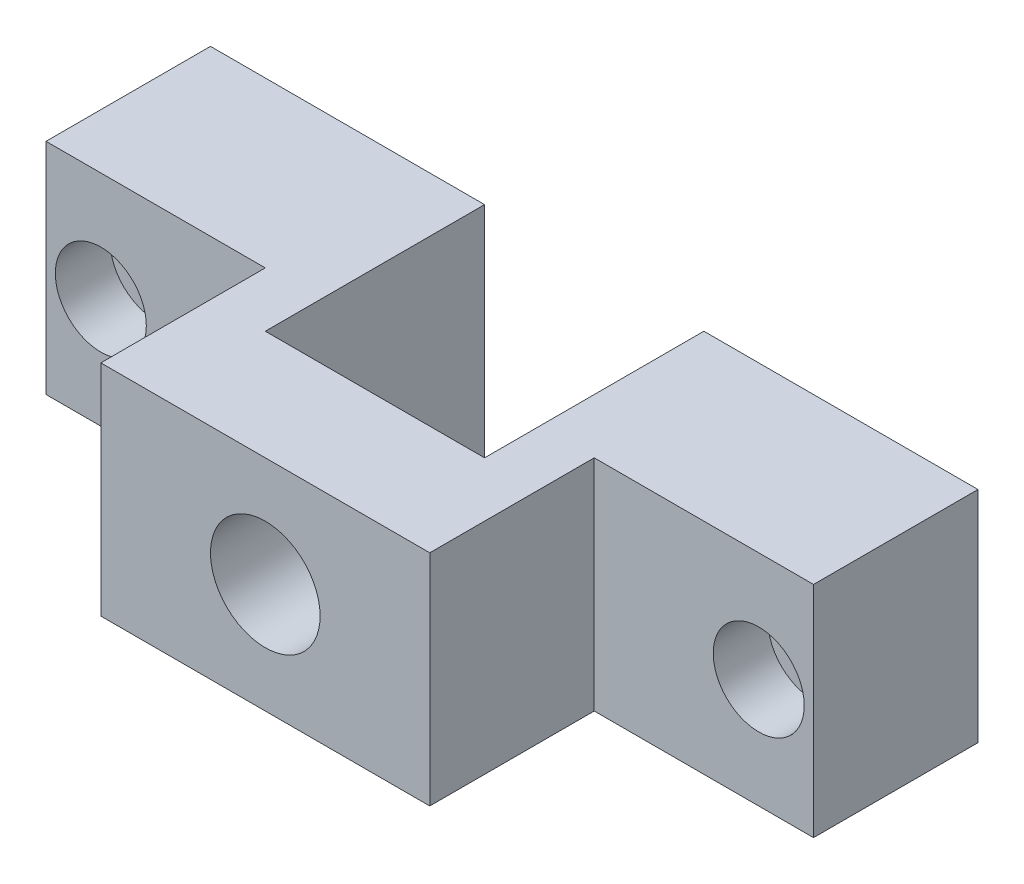
ISO-10303-21;
HEADER;
FILE_DESCRIPTION(('STEP AP214'),'2;1');
FILE_NAME('part.step','',(''),(''),'','','');
FILE_SCHEMA(('AUTOMOTIVE_DESIGN { 1 0 10303 214 1 1 1 1 }'));
ENDSEC;
DATA;
#1=APPLICATION_CONTEXT('core data for automotive mechanical design processes');
#2=APPLICATION_PROTOCOL_DEFINITION('international standard','automotive_design',2000,#1);
#3=PRODUCT_CONTEXT('',#1,'mechanical');
#4=PRODUCT('Part','Part','',(#3));
#5=PRODUCT_RELATED_PRODUCT_CATEGORY('part','',(#4));
#6=PRODUCT_DEFINITION_FORMATION('','',#4);
#7=PRODUCT_DEFINITION_CONTEXT('part definition',#1,'design');
#8=PRODUCT_DEFINITION('design','',#6,#7);
#9=PRODUCT_DEFINITION_SHAPE('','',#8);
#10=(LENGTH_UNIT() NAMED_UNIT(*) SI_UNIT(.MILLI.,.METRE.));
#11=(NAMED_UNIT(*) PLANE_ANGLE_UNIT() SI_UNIT($,.RADIAN.));
#12=(NAMED_UNIT(*) SI_UNIT($,.STERADIAN.) SOLID_ANGLE_UNIT());
#13=UNCERTAINTY_MEASURE_WITH_UNIT(LENGTH_MEASURE(1.E-05),#10,'distance_accuracy_value','');
#14=(GEOMETRIC_REPRESENTATION_CONTEXT(3) GLOBAL_UNCERTAINTY_ASSIGNED_CONTEXT((#13)) GLOBAL_UNIT_ASSIGNED_CONTEXT((#10,
#11,#12)) REPRESENTATION_CONTEXT('',''));
#15=CARTESIAN_POINT('',(0.,0.,0.));
#16=DIRECTION('',(0.,0.,1.));
#17=DIRECTION('',(1.,0.,0.));
#18=AXIS2_PLACEMENT_3D('',#15,#16,#17);
#19=CARTESIAN_POINT('',(65.,10.,15.));
#20=DIRECTION('',(0.,0.,-1.));
#21=DIRECTION('',(-1.,0.,0.));
#22=AXIS2_PLACEMENT_3D('',#19,#20,#21);
#23=CYLINDRICAL_SURFACE('',#22,2.49999999999999);
#24=CARTESIAN_POINT('',(65.,10.,0.));
#25=DIRECTION('',(0.,0.,1.));
#26=DIRECTION('',(1.,0.,0.));
#27=AXIS2_PLACEMENT_3D('',#24,#25,#26);
#28=CIRCLE('',#27,2.49999999999999);
#29=CARTESIAN_POINT('',(67.5,10.,0.));
#30=VERTEX_POINT('',#29);
#31=EDGE_CURVE('E216',#30,#30,#28,.T.);
#32=ORIENTED_EDGE('',*,*,#31,.F.);
#33=EDGE_LOOP('',(#32));
#34=FACE_BOUND('',#33,.T.);
#35=CARTESIAN_POINT('',(65.,10.,10.));
#36=DIRECTION('',(0.,0.,1.));
#37=DIRECTION('',(1.,0.,0.));
#38=AXIS2_PLACEMENT_3D('',#35,#36,#37);
#39=CIRCLE('',#38,2.49999999999999);
#40=CARTESIAN_POINT('',(67.5,10.,10.));
#41=VERTEX_POINT('',#40);
#42=EDGE_CURVE('E42',#41,#41,#39,.T.);
#43=ORIENTED_EDGE('',*,*,#42,.T.);
#44=EDGE_LOOP('',(#43));
#45=FACE_BOUND('',#44,.T.);
#46=ADVANCED_FACE('F38',(#34,#45),#23,.F.);
#47=CARTESIAN_POINT('',(5.,10.,15.));
#48=DIRECTION('',(0.,0.,-1.));
#49=DIRECTION('',(-1.,0.,0.));
#50=AXIS2_PLACEMENT_3D('',#47,#48,#49);
#51=CYLINDRICAL_SURFACE('',#50,2.49999999999999);
#52=CARTESIAN_POINT('',(5.,10.,0.));
#53=DIRECTION('',(0.,0.,1.));
#54=DIRECTION('',(1.,0.,0.));
#55=AXIS2_PLACEMENT_3D('',#52,#53,#54);
#56=CIRCLE('',#55,2.49999999999999);
#57=CARTESIAN_POINT('',(7.49999999999999,10.,0.));
#58=VERTEX_POINT('',#57);
#59=EDGE_CURVE('E212',#58,#58,#56,.T.);
#60=ORIENTED_EDGE('',*,*,#59,.F.);
#61=EDGE_LOOP('',(#60));
#62=FACE_BOUND('',#61,.T.);
#63=CARTESIAN_POINT('',(5.,10.,10.));
#64=DIRECTION('',(0.,0.,1.));
#65=DIRECTION('',(1.,0.,0.));
#66=AXIS2_PLACEMENT_3D('',#63,#64,#65);
#67=CIRCLE('',#66,2.49999999999999);
#68=CARTESIAN_POINT('',(7.49999999999999,10.,10.));
#69=VERTEX_POINT('',#68);
#70=EDGE_CURVE('E263',#69,#69,#67,.T.);
#71=ORIENTED_EDGE('',*,*,#70,.T.);
#72=EDGE_LOOP('',(#71));
#73=FACE_BOUND('',#72,.T.);
#74=ADVANCED_FACE('F305',(#62,#73),#51,.F.);
#75=CARTESIAN_POINT('',(0.,0.,0.));
#76=DIRECTION('',(0.,0.,-1.));
#77=DIRECTION('',(-1.,0.,0.));
#78=AXIS2_PLACEMENT_3D('',#75,#76,#77);
#79=PLANE('',#78);
#80=DIRECTION('',(0.,1.,0.));
#81=VECTOR('',#80,1.);
#82=CARTESIAN_POINT('',(25.,0.,0.));
#83=LINE('',#82,#81);
#84=CARTESIAN_POINT('',(25.,0.,0.));
#85=VERTEX_POINT('',#84);
#86=CARTESIAN_POINT('',(25.,20.,0.));
#87=VERTEX_POINT('',#86);
#88=EDGE_CURVE('E168',#85,#87,#83,.T.);
#89=ORIENTED_EDGE('',*,*,#88,.F.);
#90=DIRECTION('',(1.,0.,0.));
#91=VECTOR('',#90,1.);
#92=CARTESIAN_POINT('',(0.,0.,0.));
#93=LINE('',#92,#91);
#94=CARTESIAN_POINT('',(0.,0.,0.));
#95=VERTEX_POINT('',#94);
#96=EDGE_CURVE('E150',#95,#85,#93,.T.);
#97=ORIENTED_EDGE('',*,*,#96,.F.);
#98=DIRECTION('',(0.,-1.,0.));
#99=VECTOR('',#98,1.);
#100=CARTESIAN_POINT('',(0.,0.,0.));
#101=LINE('',#100,#99);
#102=CARTESIAN_POINT('',(0.,20.,0.));
#103=VERTEX_POINT('',#102);
#104=EDGE_CURVE('E220',#103,#95,#101,.T.);
#105=ORIENTED_EDGE('',*,*,#104,.F.);
#106=DIRECTION('',(-1.,0.,0.));
#107=VECTOR('',#106,1.);
#108=CARTESIAN_POINT('',(0.,20.,0.));
#109=LINE('',#108,#107);
#110=EDGE_CURVE('E247',#87,#103,#109,.T.);
#111=ORIENTED_EDGE('',*,*,#110,.F.);
#112=EDGE_LOOP('',(#89,#97,#105,#111));
#113=FACE_BOUND('',#112,.T.);
#114=ORIENTED_EDGE('',*,*,#59,.T.);
#115=EDGE_LOOP('',(#114));
#116=FACE_BOUND('',#115,.T.);
#117=ADVANCED_FACE('F313',(#113,#116),#79,.T.);
#118=CARTESIAN_POINT('',(0.,0.,15.));
#119=DIRECTION('',(0.,0.,-1.));
#120=DIRECTION('',(-1.,0.,0.));
#121=AXIS2_PLACEMENT_3D('',#118,#119,#120);
#122=PLANE('',#121);
#123=CARTESIAN_POINT('',(5.,10.,15.));
#124=DIRECTION('',(0.,0.,1.));
#125=DIRECTION('',(1.,0.,0.));
#126=AXIS2_PLACEMENT_3D('',#123,#124,#125);
#127=CIRCLE('',#126,4.15);
#128=CARTESIAN_POINT('',(9.15,10.,15.));
#129=VERTEX_POINT('',#128);
#130=EDGE_CURVE('E273',#129,#129,#127,.T.);
#131=ORIENTED_EDGE('',*,*,#130,.F.);
#132=EDGE_LOOP('',(#131));
#133=FACE_BOUND('',#132,.T.);
#134=DIRECTION('',(0.,-1.,0.));
#135=VECTOR('',#134,1.);
#136=CARTESIAN_POINT('',(20.,0.,15.));
#137=LINE('',#136,#135);
#138=CARTESIAN_POINT('',(20.,20.,15.));
#139=VERTEX_POINT('',#138);
#140=CARTESIAN_POINT('',(20.,0.,15.));
#141=VERTEX_POINT('',#140);
#142=EDGE_CURVE('E64',#139,#141,#137,.T.);
#143=ORIENTED_EDGE('',*,*,#142,.F.);
#144=DIRECTION('',(-1.,0.,0.));
#145=VECTOR('',#144,1.);
#146=CARTESIAN_POINT('',(0.,20.,15.));
#147=LINE('',#146,#145);
#148=CARTESIAN_POINT('',(0.,20.,15.));
#149=VERTEX_POINT('',#148);
#150=EDGE_CURVE('E233',#139,#149,#147,.T.);
#151=ORIENTED_EDGE('',*,*,#150,.T.);
#152=DIRECTION('',(0.,-1.,0.));
#153=VECTOR('',#152,1.);
#154=CARTESIAN_POINT('',(0.,0.,15.));
#155=LINE('',#154,#153);
#156=CARTESIAN_POINT('',(0.,0.,15.));
#157=VERTEX_POINT('',#156);
#158=EDGE_CURVE('E221',#149,#157,#155,.T.);
#159=ORIENTED_EDGE('',*,*,#158,.T.);
#160=DIRECTION('',(1.,0.,0.));
#161=VECTOR('',#160,1.);
#162=CARTESIAN_POINT('',(0.,0.,15.));
#163=LINE('',#162,#161);
#164=EDGE_CURVE('E227',#157,#141,#163,.T.);
#165=ORIENTED_EDGE('',*,*,#164,.T.);
#166=EDGE_LOOP('',(#143,#151,#159,#165));
#167=FACE_BOUND('',#166,.T.);
#168=ADVANCED_FACE('F319',(#133,#167),#122,.F.);
#169=CARTESIAN_POINT('',(65.,10.,15.));
#170=DIRECTION('',(0.,0.,1.));
#171=DIRECTION('',(1.,0.,0.));
#172=AXIS2_PLACEMENT_3D('',#169,#170,#171);
#173=CIRCLE('',#172,4.15);
#174=CARTESIAN_POINT('',(69.15,10.,15.));
#175=VERTEX_POINT('',#174);
#176=EDGE_CURVE('E280',#175,#175,#173,.T.);
#177=ORIENTED_EDGE('',*,*,#176,.F.);
#178=EDGE_LOOP('',(#177));
#179=FACE_BOUND('',#178,.T.);
#180=DIRECTION('',(0.,1.,0.));
#181=VECTOR('',#180,1.);
#182=CARTESIAN_POINT('',(50.,0.,15.));
#183=LINE('',#182,#181);
#184=CARTESIAN_POINT('',(50.,0.,15.));
#185=VERTEX_POINT('',#184);
#186=CARTESIAN_POINT('',(50.,20.,15.));
#187=VERTEX_POINT('',#186);
#188=EDGE_CURVE('E182',#185,#187,#183,.T.);
#189=ORIENTED_EDGE('',*,*,#188,.F.);
#190=CARTESIAN_POINT('',(70.,0.,15.));
#191=VERTEX_POINT('',#190);
#192=EDGE_CURVE('E225',#185,#191,#163,.T.);
#193=ORIENTED_EDGE('',*,*,#192,.T.);
#194=DIRECTION('',(0.,1.,0.));
#195=VECTOR('',#194,1.);
#196=CARTESIAN_POINT('',(70.,0.,15.));
#197=LINE('',#196,#195);
#198=CARTESIAN_POINT('',(70.,20.,15.));
#199=VERTEX_POINT('',#198);
#200=EDGE_CURVE('E230',#191,#199,#197,.T.);
#201=ORIENTED_EDGE('',*,*,#200,.T.);
#202=EDGE_CURVE('E234',#199,#187,#147,.T.);
#203=ORIENTED_EDGE('',*,*,#202,.T.);
#204=EDGE_LOOP('',(#189,#193,#201,#203));
#205=FACE_BOUND('',#204,.T.);
#206=ADVANCED_FACE('F322',(#179,#205),#122,.F.);
#207=DIRECTION('',(0.,1.,0.));
#208=VECTOR('',#207,1.);
#209=CARTESIAN_POINT('',(45.,0.,0.));
#210=LINE('',#209,#208);
#211=CARTESIAN_POINT('',(45.,0.,0.));
#212=VERTEX_POINT('',#211);
#213=CARTESIAN_POINT('',(45.,20.,0.));
#214=VERTEX_POINT('',#213);
#215=EDGE_CURVE('E171',#212,#214,#210,.T.);
#216=ORIENTED_EDGE('',*,*,#215,.T.);
#217=CARTESIAN_POINT('',(70.,20.,0.));
#218=VERTEX_POINT('',#217);
#219=EDGE_CURVE('E226',#218,#214,#109,.T.);
#220=ORIENTED_EDGE('',*,*,#219,.F.);
#221=DIRECTION('',(0.,1.,0.));
#222=VECTOR('',#221,1.);
#223=CARTESIAN_POINT('',(70.,0.,0.));
#224=LINE('',#223,#222);
#225=CARTESIAN_POINT('',(70.,0.,0.));
#226=VERTEX_POINT('',#225);
#227=EDGE_CURVE('E244',#226,#218,#224,.T.);
#228=ORIENTED_EDGE('',*,*,#227,.F.);
#229=EDGE_CURVE('E241',#212,#226,#93,.T.);
#230=ORIENTED_EDGE('',*,*,#229,.F.);
#231=EDGE_LOOP('',(#216,#220,#228,#230));
#232=FACE_BOUND('',#231,.T.);
#233=ORIENTED_EDGE('',*,*,#31,.T.);
#234=EDGE_LOOP('',(#233));
#235=FACE_BOUND('',#234,.T.);
#236=ADVANCED_FACE('F324',(#232,#235),#79,.T.);
#237=CARTESIAN_POINT('',(0.,0.,15.));
#238=DIRECTION('',(1.,0.,0.));
#239=DIRECTION('',(0.,0.,-1.));
#240=AXIS2_PLACEMENT_3D('',#237,#238,#239);
#241=PLANE('',#240);
#242=ORIENTED_EDGE('',*,*,#104,.T.);
#243=DIRECTION('',(0.,0.,-1.));
#244=VECTOR('',#243,1.);
#245=CARTESIAN_POINT('',(0.,0.,15.));
#246=LINE('',#245,#244);
#247=EDGE_CURVE('E11',#157,#95,#246,.T.);
#248=ORIENTED_EDGE('',*,*,#247,.F.);
#249=ORIENTED_EDGE('',*,*,#158,.F.);
#250=DIRECTION('',(0.,0.,-1.));
#251=VECTOR('',#250,1.);
#252=CARTESIAN_POINT('',(0.,20.,15.));
#253=LINE('',#252,#251);
#254=EDGE_CURVE('E237',#149,#103,#253,.T.);
#255=ORIENTED_EDGE('',*,*,#254,.T.);
#256=EDGE_LOOP('',(#242,#248,#249,#255));
#257=FACE_BOUND('',#256,.T.);
#258=ADVANCED_FACE('F40',(#257),#241,.F.);
#259=CARTESIAN_POINT('',(0.,0.,15.));
#260=DIRECTION('',(0.,1.,0.));
#261=DIRECTION('',(0.,0.,1.));
#262=AXIS2_PLACEMENT_3D('',#259,#260,#261);
#263=PLANE('',#262);
#264=ORIENTED_EDGE('',*,*,#96,.T.);
#265=DIRECTION('',(0.,0.,1.));
#266=VECTOR('',#265,1.);
#267=CARTESIAN_POINT('',(25.,0.,20.));
#268=LINE('',#267,#266);
#269=CARTESIAN_POINT('',(25.,0.,20.));
#270=VERTEX_POINT('',#269);
#271=EDGE_CURVE('E131',#85,#270,#268,.T.);
#272=ORIENTED_EDGE('',*,*,#271,.T.);
#273=DIRECTION('',(1.,0.,0.));
#274=VECTOR('',#273,1.);
#275=CARTESIAN_POINT('',(25.,0.,20.));
#276=LINE('',#275,#274);
#277=CARTESIAN_POINT('',(45.,0.,20.));
#278=VERTEX_POINT('',#277);
#279=EDGE_CURVE('E141',#270,#278,#276,.T.);
#280=ORIENTED_EDGE('',*,*,#279,.T.);
#281=DIRECTION('',(0.,0.,-1.));
#282=VECTOR('',#281,1.);
#283=CARTESIAN_POINT('',(45.,0.,20.));
#284=LINE('',#283,#282);
#285=EDGE_CURVE('E138',#278,#212,#284,.T.);
#286=ORIENTED_EDGE('',*,*,#285,.T.);
#287=ORIENTED_EDGE('',*,*,#229,.T.);
#288=DIRECTION('',(0.,0.,-1.));
#289=VECTOR('',#288,1.);
#290=CARTESIAN_POINT('',(70.,0.,15.));
#291=LINE('',#290,#289);
#292=EDGE_CURVE('E48',#191,#226,#291,.T.);
#293=ORIENTED_EDGE('',*,*,#292,.F.);
#294=ORIENTED_EDGE('',*,*,#192,.F.);
#295=DIRECTION('',(0.,0.,-1.));
#296=VECTOR('',#295,1.);
#297=CARTESIAN_POINT('',(50.,0.,30.));
#298=LINE('',#297,#296);
#299=CARTESIAN_POINT('',(50.,0.,30.));
#300=VERTEX_POINT('',#299);
#301=EDGE_CURVE('E204',#300,#185,#298,.T.);
#302=ORIENTED_EDGE('',*,*,#301,.F.);
#303=DIRECTION('',(1.,0.,0.));
#304=VECTOR('',#303,1.);
#305=CARTESIAN_POINT('',(20.,0.,30.));
#306=LINE('',#305,#304);
#307=CARTESIAN_POINT('',(20.,0.,30.));
#308=VERTEX_POINT('',#307);
#309=EDGE_CURVE('E181',#308,#300,#306,.T.);
#310=ORIENTED_EDGE('',*,*,#309,.F.);
#311=DIRECTION('',(0.,0.,-1.));
#312=VECTOR('',#311,1.);
#313=CARTESIAN_POINT('',(20.,0.,30.));
#314=LINE('',#313,#312);
#315=EDGE_CURVE('E208',#308,#141,#314,.T.);
#316=ORIENTED_EDGE('',*,*,#315,.T.);
#317=ORIENTED_EDGE('',*,*,#164,.F.);
#318=ORIENTED_EDGE('',*,*,#247,.T.);
#319=EDGE_LOOP('',(#264,#272,#280,#286,#287,#293,#294,#302,#310,#316,#317,#318));
#320=FACE_BOUND('',#319,.T.);
#321=ADVANCED_FACE('F149',(#320),#263,.F.);
#322=CARTESIAN_POINT('',(70.,0.,15.));
#323=DIRECTION('',(-1.,0.,0.));
#324=DIRECTION('',(0.,0.,1.));
#325=AXIS2_PLACEMENT_3D('',#322,#323,#324);
#326=PLANE('',#325);
#327=ORIENTED_EDGE('',*,*,#227,.T.);
#328=DIRECTION('',(0.,0.,-1.));
#329=VECTOR('',#328,1.);
#330=CARTESIAN_POINT('',(70.,20.,15.));
#331=LINE('',#330,#329);
#332=EDGE_CURVE('E254',#199,#218,#331,.T.);
#333=ORIENTED_EDGE('',*,*,#332,.F.);
#334=ORIENTED_EDGE('',*,*,#200,.F.);
#335=ORIENTED_EDGE('',*,*,#292,.T.);
#336=EDGE_LOOP('',(#327,#333,#334,#335));
#337=FACE_BOUND('',#336,.T.);
#338=ADVANCED_FACE('F332',(#337),#326,.F.);
#339=CARTESIAN_POINT('',(0.,20.,15.));
#340=DIRECTION('',(0.,-1.,0.));
#341=DIRECTION('',(0.,0.,-1.));
#342=AXIS2_PLACEMENT_3D('',#339,#340,#341);
#343=PLANE('',#342);
#344=DIRECTION('',(1.,0.,0.));
#345=VECTOR('',#344,1.);
#346=CARTESIAN_POINT('',(25.,20.,20.));
#347=LINE('',#346,#345);
#348=CARTESIAN_POINT('',(25.,20.,20.));
#349=VERTEX_POINT('',#348);
#350=CARTESIAN_POINT('',(45.,20.,20.));
#351=VERTEX_POINT('',#350);
#352=EDGE_CURVE('E155',#349,#351,#347,.T.);
#353=ORIENTED_EDGE('',*,*,#352,.F.);
#354=DIRECTION('',(0.,0.,1.));
#355=VECTOR('',#354,1.);
#356=CARTESIAN_POINT('',(25.,20.,20.));
#357=LINE('',#356,#355);
#358=EDGE_CURVE('E56',#87,#349,#357,.T.);
#359=ORIENTED_EDGE('',*,*,#358,.F.);
#360=ORIENTED_EDGE('',*,*,#110,.T.);
#361=ORIENTED_EDGE('',*,*,#254,.F.);
#362=ORIENTED_EDGE('',*,*,#150,.F.);
#363=DIRECTION('',(0.,0.,-1.));
#364=VECTOR('',#363,1.);
#365=CARTESIAN_POINT('',(20.,20.,30.));
#366=LINE('',#365,#364);
#367=CARTESIAN_POINT('',(20.,20.,30.));
#368=VERTEX_POINT('',#367);
#369=EDGE_CURVE('E191',#368,#139,#366,.T.);
#370=ORIENTED_EDGE('',*,*,#369,.F.);
#371=DIRECTION('',(-1.,0.,0.));
#372=VECTOR('',#371,1.);
#373=CARTESIAN_POINT('',(20.,20.,30.));
#374=LINE('',#373,#372);
#375=CARTESIAN_POINT('',(50.,20.,30.));
#376=VERTEX_POINT('',#375);
#377=EDGE_CURVE('E188',#376,#368,#374,.T.);
#378=ORIENTED_EDGE('',*,*,#377,.F.);
#379=DIRECTION('',(0.,0.,-1.));
#380=VECTOR('',#379,1.);
#381=CARTESIAN_POINT('',(50.,20.,30.));
#382=LINE('',#381,#380);
#383=EDGE_CURVE('E200',#376,#187,#382,.T.);
#384=ORIENTED_EDGE('',*,*,#383,.T.);
#385=ORIENTED_EDGE('',*,*,#202,.F.);
#386=ORIENTED_EDGE('',*,*,#332,.T.);
#387=ORIENTED_EDGE('',*,*,#219,.T.);
#388=DIRECTION('',(0.,0.,-1.));
#389=VECTOR('',#388,1.);
#390=CARTESIAN_POINT('',(45.,20.,20.));
#391=LINE('',#390,#389);
#392=EDGE_CURVE('E152',#351,#214,#391,.T.);
#393=ORIENTED_EDGE('',*,*,#392,.F.);
#394=EDGE_LOOP('',(#353,#359,#360,#361,#362,#370,#378,#384,#385,#386,#387,#393));
#395=FACE_BOUND('',#394,.T.);
#396=ADVANCED_FACE('F328',(#395),#343,.F.);
#397=CARTESIAN_POINT('',(20.,0.,30.));
#398=DIRECTION('',(1.,0.,0.));
#399=DIRECTION('',(0.,0.,-1.));
#400=AXIS2_PLACEMENT_3D('',#397,#398,#399);
#401=PLANE('',#400);
#402=ORIENTED_EDGE('',*,*,#142,.T.);
#403=ORIENTED_EDGE('',*,*,#315,.F.);
#404=DIRECTION('',(0.,-1.,0.));
#405=VECTOR('',#404,1.);
#406=CARTESIAN_POINT('',(20.,0.,30.));
#407=LINE('',#406,#405);
#408=EDGE_CURVE('E177',#368,#308,#407,.T.);
#409=ORIENTED_EDGE('',*,*,#408,.F.);
#410=ORIENTED_EDGE('',*,*,#369,.T.);
#411=EDGE_LOOP('',(#402,#403,#409,#410));
#412=FACE_BOUND('',#411,.T.);
#413=ADVANCED_FACE('F331',(#412),#401,.F.);
#414=CARTESIAN_POINT('',(50.,0.,30.));
#415=DIRECTION('',(-1.,0.,0.));
#416=DIRECTION('',(0.,0.,1.));
#417=AXIS2_PLACEMENT_3D('',#414,#415,#416);
#418=PLANE('',#417);
#419=ORIENTED_EDGE('',*,*,#188,.T.);
#420=ORIENTED_EDGE('',*,*,#383,.F.);
#421=DIRECTION('',(0.,1.,0.));
#422=VECTOR('',#421,1.);
#423=CARTESIAN_POINT('',(50.,0.,30.));
#424=LINE('',#423,#422);
#425=EDGE_CURVE('E185',#300,#376,#424,.T.);
#426=ORIENTED_EDGE('',*,*,#425,.F.);
#427=ORIENTED_EDGE('',*,*,#301,.T.);
#428=EDGE_LOOP('',(#419,#420,#426,#427));
#429=FACE_BOUND('',#428,.T.);
#430=ADVANCED_FACE('F369',(#429),#418,.F.);
#431=CARTESIAN_POINT('',(0.,0.,30.));
#432=DIRECTION('',(0.,0.,-1.));
#433=DIRECTION('',(-1.,0.,0.));
#434=AXIS2_PLACEMENT_3D('',#431,#432,#433);
#435=PLANE('',#434);
#436=CARTESIAN_POINT('',(35.,10.,30.));
#437=DIRECTION('',(0.,0.,1.));
#438=DIRECTION('',(1.,0.,0.));
#439=AXIS2_PLACEMENT_3D('',#436,#437,#438);
#440=CIRCLE('',#439,5.);
#441=CARTESIAN_POINT('',(40.,10.,30.));
#442=VERTEX_POINT('',#441);
#443=EDGE_CURVE('E158',#442,#442,#440,.T.);
#444=ORIENTED_EDGE('',*,*,#443,.F.);
#445=EDGE_LOOP('',(#444));
#446=FACE_BOUND('',#445,.T.);
#447=ORIENTED_EDGE('',*,*,#408,.T.);
#448=ORIENTED_EDGE('',*,*,#309,.T.);
#449=ORIENTED_EDGE('',*,*,#425,.T.);
#450=ORIENTED_EDGE('',*,*,#377,.T.);
#451=EDGE_LOOP('',(#447,#448,#449,#450));
#452=FACE_BOUND('',#451,.T.);
#453=ADVANCED_FACE('F375',(#446,#452),#435,.F.);
#454=CARTESIAN_POINT('',(25.,0.,20.));
#455=DIRECTION('',(-1.,0.,0.));
#456=DIRECTION('',(0.,0.,1.));
#457=AXIS2_PLACEMENT_3D('',#454,#455,#456);
#458=PLANE('',#457);
#459=ORIENTED_EDGE('',*,*,#358,.T.);
#460=DIRECTION('',(0.,1.,0.));
#461=VECTOR('',#460,1.);
#462=CARTESIAN_POINT('',(25.,0.,20.));
#463=LINE('',#462,#461);
#464=EDGE_CURVE('E127',#270,#349,#463,.T.);
#465=ORIENTED_EDGE('',*,*,#464,.F.);
#466=ORIENTED_EDGE('',*,*,#271,.F.);
#467=ORIENTED_EDGE('',*,*,#88,.T.);
#468=EDGE_LOOP('',(#459,#465,#466,#467));
#469=FACE_BOUND('',#468,.T.);
#470=ADVANCED_FACE('F129',(#469),#458,.F.);
#471=CARTESIAN_POINT('',(45.,0.,20.));
#472=DIRECTION('',(1.,0.,0.));
#473=DIRECTION('',(0.,0.,-1.));
#474=AXIS2_PLACEMENT_3D('',#471,#472,#473);
#475=PLANE('',#474);
#476=ORIENTED_EDGE('',*,*,#392,.T.);
#477=ORIENTED_EDGE('',*,*,#215,.F.);
#478=ORIENTED_EDGE('',*,*,#285,.F.);
#479=DIRECTION('',(0.,1.,0.));
#480=VECTOR('',#479,1.);
#481=CARTESIAN_POINT('',(45.,0.,20.));
#482=LINE('',#481,#480);
#483=EDGE_CURVE('E137',#278,#351,#482,.T.);
#484=ORIENTED_EDGE('',*,*,#483,.T.);
#485=EDGE_LOOP('',(#476,#477,#478,#484));
#486=FACE_BOUND('',#485,.T.);
#487=ADVANCED_FACE('F388',(#486),#475,.F.);
#488=CARTESIAN_POINT('',(25.,0.,20.));
#489=DIRECTION('',(0.,0.,1.));
#490=DIRECTION('',(1.,0.,0.));
#491=AXIS2_PLACEMENT_3D('',#488,#489,#490);
#492=PLANE('',#491);
#493=CARTESIAN_POINT('',(35.,10.,20.));
#494=DIRECTION('',(0.,0.,1.));
#495=DIRECTION('',(1.,0.,0.));
#496=AXIS2_PLACEMENT_3D('',#493,#494,#495);
#497=CIRCLE('',#496,5.);
#498=CARTESIAN_POINT('',(40.,10.,20.));
#499=VERTEX_POINT('',#498);
#500=EDGE_CURVE('E165',#499,#499,#497,.T.);
#501=ORIENTED_EDGE('',*,*,#500,.T.);
#502=EDGE_LOOP('',(#501));
#503=FACE_BOUND('',#502,.T.);
#504=ORIENTED_EDGE('',*,*,#352,.T.);
#505=ORIENTED_EDGE('',*,*,#483,.F.);
#506=ORIENTED_EDGE('',*,*,#279,.F.);
#507=ORIENTED_EDGE('',*,*,#464,.T.);
#508=EDGE_LOOP('',(#504,#505,#506,#507));
#509=FACE_BOUND('',#508,.T.);
#510=ADVANCED_FACE('F142',(#503,#509),#492,.F.);
#511=CARTESIAN_POINT('',(35.,10.,0.));
#512=DIRECTION('',(0.,0.,1.));
#513=DIRECTION('',(1.,0.,0.));
#514=AXIS2_PLACEMENT_3D('',#511,#512,#513);
#515=CYLINDRICAL_SURFACE('',#514,5.);
#516=ORIENTED_EDGE('',*,*,#443,.T.);
#517=EDGE_LOOP('',(#516));
#518=FACE_BOUND('',#517,.T.);
#519=ORIENTED_EDGE('',*,*,#500,.F.);
#520=EDGE_LOOP('',(#519));
#521=FACE_BOUND('',#520,.T.);
#522=ADVANCED_FACE('F391',(#518,#521),#515,.F.);
#523=CARTESIAN_POINT('',(5.,10.,10.));
#524=DIRECTION('',(0.,0.,1.));
#525=DIRECTION('',(1.,0.,0.));
#526=AXIS2_PLACEMENT_3D('',#523,#524,#525);
#527=CYLINDRICAL_SURFACE('',#526,4.15);
#528=CARTESIAN_POINT('',(5.,10.,10.));
#529=DIRECTION('',(0.,0.,1.));
#530=DIRECTION('',(1.,0.,0.));
#531=AXIS2_PLACEMENT_3D('',#528,#529,#530);
#532=CIRCLE('',#531,4.15);
#533=CARTESIAN_POINT('',(9.15,10.,10.));
#534=VERTEX_POINT('',#533);
#535=EDGE_CURVE('E266',#534,#534,#532,.T.);
#536=ORIENTED_EDGE('',*,*,#535,.F.);
#537=EDGE_LOOP('',(#536));
#538=FACE_BOUND('',#537,.T.);
#539=ORIENTED_EDGE('',*,*,#130,.T.);
#540=EDGE_LOOP('',(#539));
#541=FACE_BOUND('',#540,.T.);
#542=ADVANCED_FACE('F398',(#538,#541),#527,.F.);
#543=CARTESIAN_POINT('',(5.,10.,10.));
#544=DIRECTION('',(0.,0.,1.));
#545=DIRECTION('',(1.,0.,0.));
#546=AXIS2_PLACEMENT_3D('',#543,#544,#545);
#547=PLANE('',#546);
#548=ORIENTED_EDGE('',*,*,#70,.F.);
#549=EDGE_LOOP('',(#548));
#550=FACE_BOUND('',#549,.T.);
#551=ORIENTED_EDGE('',*,*,#535,.T.);
#552=EDGE_LOOP('',(#551));
#553=FACE_BOUND('',#552,.T.);
#554=ADVANCED_FACE('F301',(#550,#553),#547,.T.);
#555=CARTESIAN_POINT('',(65.,10.,10.));
#556=DIRECTION('',(0.,0.,1.));
#557=DIRECTION('',(1.,0.,0.));
#558=AXIS2_PLACEMENT_3D('',#555,#556,#557);
#559=CYLINDRICAL_SURFACE('',#558,4.15);
#560=CARTESIAN_POINT('',(65.,10.,10.));
#561=DIRECTION('',(0.,0.,1.));
#562=DIRECTION('',(1.,0.,0.));
#563=AXIS2_PLACEMENT_3D('',#560,#561,#562);
#564=CIRCLE('',#563,4.15);
#565=CARTESIAN_POINT('',(69.15,10.,10.));
#566=VERTEX_POINT('',#565);
#567=EDGE_CURVE('E284',#566,#566,#564,.T.);
#568=ORIENTED_EDGE('',*,*,#567,.F.);
#569=EDGE_LOOP('',(#568));
#570=FACE_BOUND('',#569,.T.);
#571=ORIENTED_EDGE('',*,*,#176,.T.);
#572=EDGE_LOOP('',(#571));
#573=FACE_BOUND('',#572,.T.);
#574=ADVANCED_FACE('F296',(#570,#573),#559,.F.);
#575=CARTESIAN_POINT('',(65.,10.,10.));
#576=DIRECTION('',(0.,0.,1.));
#577=DIRECTION('',(1.,0.,0.));
#578=AXIS2_PLACEMENT_3D('',#575,#576,#577);
#579=PLANE('',#578);
#580=ORIENTED_EDGE('',*,*,#42,.F.);
#581=EDGE_LOOP('',(#580));
#582=FACE_BOUND('',#581,.T.);
#583=ORIENTED_EDGE('',*,*,#567,.T.);
#584=EDGE_LOOP('',(#583));
#585=FACE_BOUND('',#584,.T.);
#586=ADVANCED_FACE('F294',(#582,#585),#579,.T.);
#587=CLOSED_SHELL('',(#46,#74,#117,#168,#206,#236,#258,#321,#338,#396,#413,#430,#453,#470,#487,
#510,#522,#542,#554,#574,#586));
#588=MANIFOLD_SOLID_BREP('B2',#587);
#589=ADVANCED_BREP_SHAPE_REPRESENTATION('',(#18,#588),#14);
#590=SHAPE_DEFINITION_REPRESENTATION(#9,#589);
ENDSEC;
END-ISO-10303-21;
